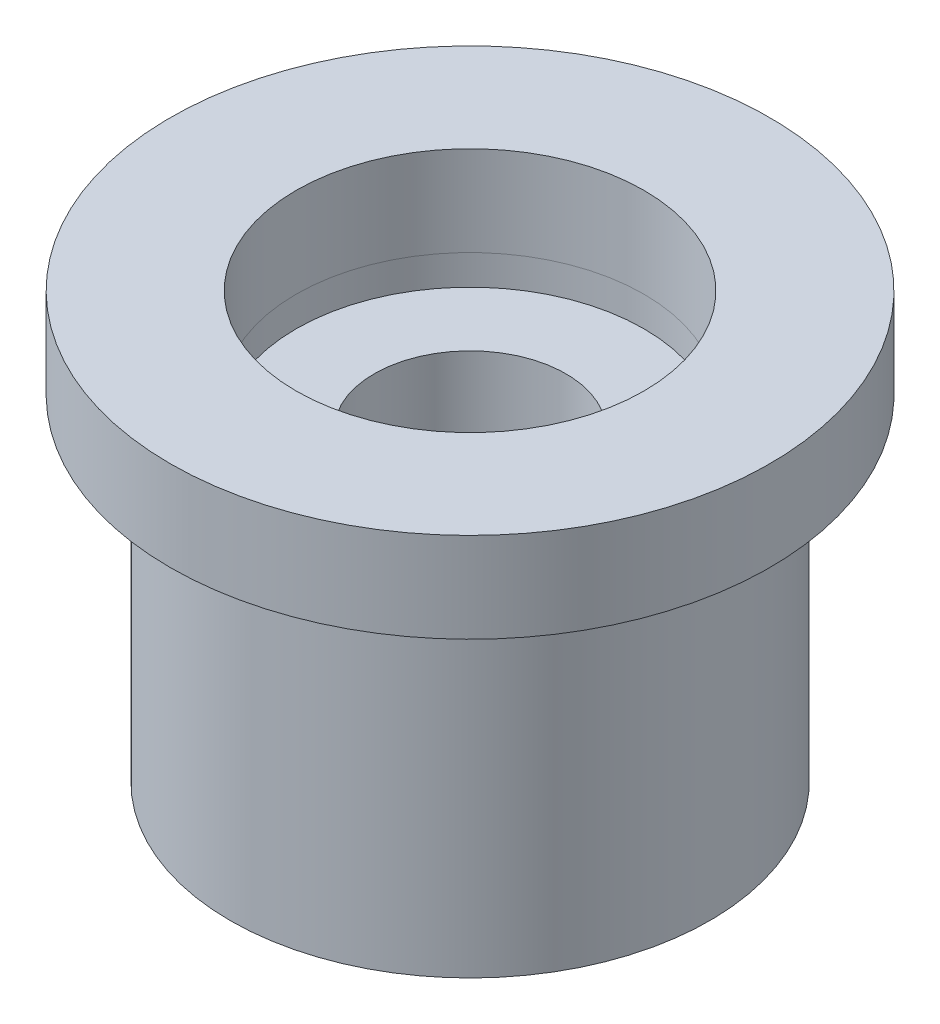
ISO-10303-21;
HEADER;
FILE_DESCRIPTION(('STEP AP214'),'2;1');
FILE_NAME('part.step','',(''),(''),'','','');
FILE_SCHEMA(('AUTOMOTIVE_DESIGN { 1 0 10303 214 1 1 1 1 }'));
ENDSEC;
DATA;
#1=APPLICATION_CONTEXT('core data for automotive mechanical design processes');
#2=APPLICATION_PROTOCOL_DEFINITION('international standard','automotive_design',2000,#1);
#3=PRODUCT_CONTEXT('',#1,'mechanical');
#4=PRODUCT('Part','Part','',(#3));
#5=PRODUCT_RELATED_PRODUCT_CATEGORY('part','',(#4));
#6=PRODUCT_DEFINITION_FORMATION('','',#4);
#7=PRODUCT_DEFINITION_CONTEXT('part definition',#1,'design');
#8=PRODUCT_DEFINITION('design','',#6,#7);
#9=PRODUCT_DEFINITION_SHAPE('','',#8);
#10=(LENGTH_UNIT() NAMED_UNIT(*) SI_UNIT(.MILLI.,.METRE.));
#11=(NAMED_UNIT(*) PLANE_ANGLE_UNIT() SI_UNIT($,.RADIAN.));
#12=(NAMED_UNIT(*) SI_UNIT($,.STERADIAN.) SOLID_ANGLE_UNIT());
#13=UNCERTAINTY_MEASURE_WITH_UNIT(LENGTH_MEASURE(1.E-05),#10,'distance_accuracy_value','');
#14=(GEOMETRIC_REPRESENTATION_CONTEXT(3) GLOBAL_UNCERTAINTY_ASSIGNED_CONTEXT((#13)) GLOBAL_UNIT_ASSIGNED_CONTEXT((#10,
#11,#12)) REPRESENTATION_CONTEXT('',''));
#15=CARTESIAN_POINT('',(0.,0.,0.));
#16=DIRECTION('',(0.,0.,1.));
#17=DIRECTION('',(1.,0.,0.));
#18=AXIS2_PLACEMENT_3D('',#15,#16,#17);
#19=CARTESIAN_POINT('',(0.,7.1,0.));
#20=DIRECTION('',(0.,-1.,0.));
#21=DIRECTION('',(0.,0.,-1.));
#22=AXIS2_PLACEMENT_3D('',#19,#20,#21);
#23=CYLINDRICAL_SURFACE('',#22,5.);
#24=CARTESIAN_POINT('',(0.,7.1,0.));
#25=DIRECTION('',(0.,1.,0.));
#26=DIRECTION('',(0.,0.,1.));
#27=AXIS2_PLACEMENT_3D('',#24,#25,#26);
#28=CIRCLE('',#27,5.);
#29=CARTESIAN_POINT('',(0.,7.1,5.));
#30=VERTEX_POINT('',#29);
#31=EDGE_CURVE('E11',#30,#30,#28,.T.);
#32=ORIENTED_EDGE('',*,*,#31,.F.);
#33=EDGE_LOOP('',(#32));
#34=FACE_BOUND('',#33,.T.);
#35=CARTESIAN_POINT('',(0.,5.6,0.));
#36=DIRECTION('',(0.,1.,0.));
#37=DIRECTION('',(0.,0.,1.));
#38=AXIS2_PLACEMENT_3D('',#35,#36,#37);
#39=CIRCLE('',#38,5.);
#40=CARTESIAN_POINT('',(0.,5.6,5.));
#41=VERTEX_POINT('',#40);
#42=EDGE_CURVE('E47',#41,#41,#39,.T.);
#43=ORIENTED_EDGE('',*,*,#42,.T.);
#44=EDGE_LOOP('',(#43));
#45=FACE_BOUND('',#44,.T.);
#46=ADVANCED_FACE('F40',(#34,#45),#23,.T.);
#47=CARTESIAN_POINT('',(0.,7.1,0.));
#48=DIRECTION('',(0.,1.,0.));
#49=DIRECTION('',(0.,0.,1.));
#50=AXIS2_PLACEMENT_3D('',#47,#48,#49);
#51=PLANE('',#50);
#52=CARTESIAN_POINT('',(0.,7.1,0.));
#53=DIRECTION('',(0.,1.,0.));
#54=DIRECTION('',(0.,0.,1.));
#55=AXIS2_PLACEMENT_3D('',#52,#53,#54);
#56=CIRCLE('',#55,2.9);
#57=CARTESIAN_POINT('',(0.,7.1,2.9));
#58=VERTEX_POINT('',#57);
#59=EDGE_CURVE('E53',#58,#58,#56,.T.);
#60=ORIENTED_EDGE('',*,*,#59,.F.);
#61=EDGE_LOOP('',(#60));
#62=FACE_BOUND('',#61,.T.);
#63=ORIENTED_EDGE('',*,*,#31,.T.);
#64=EDGE_LOOP('',(#63));
#65=FACE_BOUND('',#64,.T.);
#66=ADVANCED_FACE('F69',(#62,#65),#51,.T.);
#67=CARTESIAN_POINT('',(0.,5.6,0.));
#68=DIRECTION('',(0.,1.,0.));
#69=DIRECTION('',(0.,0.,1.));
#70=AXIS2_PLACEMENT_3D('',#67,#68,#69);
#71=PLANE('',#70);
#72=CARTESIAN_POINT('',(0.,5.6,0.));
#73=DIRECTION('',(0.,1.,0.));
#74=DIRECTION('',(0.,0.,1.));
#75=AXIS2_PLACEMENT_3D('',#72,#73,#74);
#76=CIRCLE('',#75,2.9);
#77=CARTESIAN_POINT('',(0.,5.6,2.9));
#78=VERTEX_POINT('',#77);
#79=EDGE_CURVE('E43',#78,#78,#76,.T.);
#80=ORIENTED_EDGE('',*,*,#79,.T.);
#81=EDGE_LOOP('',(#80));
#82=FACE_BOUND('',#81,.T.);
#83=ORIENTED_EDGE('',*,*,#42,.F.);
#84=EDGE_LOOP('',(#83));
#85=FACE_BOUND('',#84,.T.);
#86=ADVANCED_FACE('F60',(#82,#85),#71,.F.);
#87=CARTESIAN_POINT('',(0.,5.1,0.));
#88=DIRECTION('',(0.,1.,0.));
#89=DIRECTION('',(0.,0.,1.));
#90=AXIS2_PLACEMENT_3D('',#87,#88,#89);
#91=CYLINDRICAL_SURFACE('',#90,2.9);
#92=ORIENTED_EDGE('',*,*,#59,.T.);
#93=EDGE_LOOP('',(#92));
#94=FACE_BOUND('',#93,.T.);
#95=ORIENTED_EDGE('',*,*,#79,.F.);
#96=EDGE_LOOP('',(#95));
#97=FACE_BOUND('',#96,.T.);
#98=ADVANCED_FACE('F63',(#94,#97),#91,.F.);
#99=CLOSED_SHELL('',(#46,#66,#86,#98));
#100=MANIFOLD_SOLID_BREP('B2',#99);
#101=CARTESIAN_POINT('',(0.,5.6,0.));
#102=DIRECTION('',(0.,-1.,0.));
#103=DIRECTION('',(0.,0.,-1.));
#104=AXIS2_PLACEMENT_3D('',#101,#102,#103);
#105=CYLINDRICAL_SURFACE('',#104,4.);
#106=CARTESIAN_POINT('',(0.,5.6,0.));
#107=DIRECTION('',(0.,1.,0.));
#108=DIRECTION('',(0.,0.,1.));
#109=AXIS2_PLACEMENT_3D('',#106,#107,#108);
#110=CIRCLE('',#109,4.);
#111=CARTESIAN_POINT('',(0.,5.6,4.));
#112=VERTEX_POINT('',#111);
#113=EDGE_CURVE('E38',#112,#112,#110,.T.);
#114=ORIENTED_EDGE('',*,*,#113,.F.);
#115=EDGE_LOOP('',(#114));
#116=FACE_BOUND('',#115,.T.);
#117=CARTESIAN_POINT('',(0.,0.,0.));
#118=DIRECTION('',(0.,1.,0.));
#119=DIRECTION('',(0.,0.,1.));
#120=AXIS2_PLACEMENT_3D('',#117,#118,#119);
#121=CIRCLE('',#120,4.);
#122=CARTESIAN_POINT('',(0.,0.,4.));
#123=VERTEX_POINT('',#122);
#124=EDGE_CURVE('E109',#123,#123,#121,.T.);
#125=ORIENTED_EDGE('',*,*,#124,.T.);
#126=EDGE_LOOP('',(#125));
#127=FACE_BOUND('',#126,.T.);
#128=ADVANCED_FACE('F101',(#116,#127),#105,.T.);
#129=CARTESIAN_POINT('',(0.,5.6,0.));
#130=DIRECTION('',(0.,1.,0.));
#131=DIRECTION('',(0.,0.,1.));
#132=AXIS2_PLACEMENT_3D('',#129,#130,#131);
#133=PLANE('',#132);
#134=CARTESIAN_POINT('',(0.,5.6,0.));
#135=DIRECTION('',(0.,1.,0.));
#136=DIRECTION('',(0.,0.,1.));
#137=AXIS2_PLACEMENT_3D('',#134,#135,#136);
#138=CIRCLE('',#137,2.9);
#139=CARTESIAN_POINT('',(0.,5.6,2.9));
#140=VERTEX_POINT('',#139);
#141=EDGE_CURVE('E104',#140,#140,#138,.T.);
#142=ORIENTED_EDGE('',*,*,#141,.F.);
#143=EDGE_LOOP('',(#142));
#144=FACE_BOUND('',#143,.T.);
#145=ORIENTED_EDGE('',*,*,#113,.T.);
#146=EDGE_LOOP('',(#145));
#147=FACE_BOUND('',#146,.T.);
#148=ADVANCED_FACE('F308',(#144,#147),#133,.T.);
#149=CARTESIAN_POINT('',(0.,0.,0.));
#150=DIRECTION('',(0.,1.,0.));
#151=DIRECTION('',(0.,0.,1.));
#152=AXIS2_PLACEMENT_3D('',#149,#150,#151);
#153=PLANE('',#152);
#154=DIRECTION('',(0.499999999999992,0.,-0.866025403784443));
#155=VECTOR('',#154,1.);
#156=CARTESIAN_POINT('',(-0.786065003776817,0.,2.16150452459331));
#157=LINE('',#156,#155);
#158=CARTESIAN_POINT('',(-1.19063245338014,0.,2.86223590239484));
#159=VERTEX_POINT('',#158);
#160=CARTESIAN_POINT('',(-0.786065003776817,0.,2.16150452459331));
#161=VERTEX_POINT('',#160);
#162=EDGE_CURVE('E220',#159,#161,#157,.T.);
#163=ORIENTED_EDGE('',*,*,#162,.F.);
#164=CARTESIAN_POINT('',(0.,0.,0.));
#165=DIRECTION('',(0.,-1.,0.));
#166=DIRECTION('',(0.,0.,-1.));
#167=AXIS2_PLACEMENT_3D('',#164,#165,#166);
#168=CIRCLE('',#167,3.1);
#169=CARTESIAN_POINT('',(3.07408522978788,0.,0.4));
#170=VERTEX_POINT('',#169);
#171=EDGE_CURVE('E117',#170,#159,#168,.T.);
#172=ORIENTED_EDGE('',*,*,#171,.F.);
#173=DIRECTION('',(1.,0.,0.));
#174=VECTOR('',#173,1.);
#175=CARTESIAN_POINT('',(2.26495033058123,0.,0.4));
#176=LINE('',#175,#174);
#177=CARTESIAN_POINT('',(2.26495033058123,0.,0.4));
#178=VERTEX_POINT('',#177);
#179=EDGE_CURVE('E211',#178,#170,#176,.T.);
#180=ORIENTED_EDGE('',*,*,#179,.F.);
#181=CARTESIAN_POINT('',(0.,0.,0.));
#182=DIRECTION('',(0.,1.,0.));
#183=DIRECTION('',(0.,0.,-1.));
#184=AXIS2_PLACEMENT_3D('',#181,#182,#183);
#185=CIRCLE('',#184,2.3);
#186=EDGE_CURVE('E214',#161,#178,#185,.T.);
#187=ORIENTED_EDGE('',*,*,#186,.F.);
#188=EDGE_LOOP('',(#163,#172,#180,#187));
#189=FACE_BOUND('',#188,.T.);
#190=DIRECTION('',(-0.499999999999992,0.,0.866025403784443));
#191=VECTOR('',#190,1.);
#192=CARTESIAN_POINT('',(-1.47888532680437,0.,1.76150452459332));
#193=LINE('',#192,#191);
#194=CARTESIAN_POINT('',(-1.47888532680437,0.,1.76150452459332));
#195=VERTEX_POINT('',#194);
#196=CARTESIAN_POINT('',(-1.88345277640769,0.,2.46223590239485));
#197=VERTEX_POINT('',#196);
#198=EDGE_CURVE('E244',#195,#197,#193,.T.);
#199=ORIENTED_EDGE('',*,*,#198,.F.);
#200=CARTESIAN_POINT('',(0.,0.,0.));
#201=DIRECTION('',(0.,1.,0.));
#202=DIRECTION('',(0.,0.,-1.));
#203=AXIS2_PLACEMENT_3D('',#200,#201,#202);
#204=CIRCLE('',#203,2.3);
#205=CARTESIAN_POINT('',(-1.4788853268044,0.,-1.7615045245933));
#206=VERTEX_POINT('',#205);
#207=EDGE_CURVE('E125',#206,#195,#204,.T.);
#208=ORIENTED_EDGE('',*,*,#207,.F.);
#209=DIRECTION('',(0.500000000000004,0.,0.866025403784436));
#210=VECTOR('',#209,1.);
#211=CARTESIAN_POINT('',(-1.4788853268044,0.,-1.7615045245933));
#212=LINE('',#211,#210);
#213=CARTESIAN_POINT('',(-1.88345277640773,0.,-2.46223590239482));
#214=VERTEX_POINT('',#213);
#215=EDGE_CURVE('E233',#214,#206,#212,.T.);
#216=ORIENTED_EDGE('',*,*,#215,.F.);
#217=CARTESIAN_POINT('',(0.,0.,0.));
#218=DIRECTION('',(0.,-1.,0.));
#219=DIRECTION('',(0.,0.,-1.));
#220=AXIS2_PLACEMENT_3D('',#217,#218,#219);
#221=CIRCLE('',#220,3.1);
#222=EDGE_CURVE('E247',#197,#214,#221,.T.);
#223=ORIENTED_EDGE('',*,*,#222,.F.);
#224=EDGE_LOOP('',(#199,#208,#216,#223));
#225=FACE_BOUND('',#224,.T.);
#226=DIRECTION('',(-0.500000000000004,0.,-0.866025403784436));
#227=VECTOR('',#226,1.);
#228=CARTESIAN_POINT('',(-0.786065003776847,0.,-2.1615045245933));
#229=LINE('',#228,#227);
#230=CARTESIAN_POINT('',(-0.786065003776847,0.,-2.1615045245933));
#231=VERTEX_POINT('',#230);
#232=CARTESIAN_POINT('',(-1.19063245338018,0.,-2.86223590239482));
#233=VERTEX_POINT('',#232);
#234=EDGE_CURVE('E275',#231,#233,#229,.T.);
#235=ORIENTED_EDGE('',*,*,#234,.F.);
#236=CARTESIAN_POINT('',(0.,0.,0.));
#237=DIRECTION('',(0.,1.,0.));
#238=DIRECTION('',(0.,0.,-1.));
#239=AXIS2_PLACEMENT_3D('',#236,#237,#238);
#240=CIRCLE('',#239,2.3);
#241=CARTESIAN_POINT('',(2.26495033058123,0.,-0.4));
#242=VERTEX_POINT('',#241);
#243=EDGE_CURVE('E254',#242,#231,#240,.T.);
#244=ORIENTED_EDGE('',*,*,#243,.F.);
#245=DIRECTION('',(-1.,0.,0.));
#246=VECTOR('',#245,1.);
#247=CARTESIAN_POINT('',(2.26495033058123,0.,-0.4));
#248=LINE('',#247,#246);
#249=CARTESIAN_POINT('',(3.07408522978788,0.,-0.4));
#250=VERTEX_POINT('',#249);
#251=EDGE_CURVE('E264',#250,#242,#248,.T.);
#252=ORIENTED_EDGE('',*,*,#251,.F.);
#253=CARTESIAN_POINT('',(0.,0.,0.));
#254=DIRECTION('',(0.,-1.,0.));
#255=DIRECTION('',(0.,0.,-1.));
#256=AXIS2_PLACEMENT_3D('',#253,#254,#255);
#257=CIRCLE('',#256,3.1);
#258=EDGE_CURVE('E278',#233,#250,#257,.T.);
#259=ORIENTED_EDGE('',*,*,#258,.F.);
#260=EDGE_LOOP('',(#235,#244,#252,#259));
#261=FACE_BOUND('',#260,.T.);
#262=CARTESIAN_POINT('',(0.,0.,0.));
#263=DIRECTION('',(0.,1.,0.));
#264=DIRECTION('',(0.,0.,1.));
#265=AXIS2_PLACEMENT_3D('',#262,#263,#264);
#266=CIRCLE('',#265,1.6);
#267=CARTESIAN_POINT('',(0.,0.,1.6));
#268=VERTEX_POINT('',#267);
#269=EDGE_CURVE('E292',#268,#268,#266,.T.);
#270=ORIENTED_EDGE('',*,*,#269,.T.);
#271=EDGE_LOOP('',(#270));
#272=FACE_BOUND('',#271,.T.);
#273=ORIENTED_EDGE('',*,*,#124,.F.);
#274=EDGE_LOOP('',(#273));
#275=FACE_BOUND('',#274,.T.);
#276=ADVANCED_FACE('F311',(#189,#225,#261,#272,#275),#153,.F.);
#277=CARTESIAN_POINT('',(0.,5.1,0.));
#278=DIRECTION('',(0.,1.,0.));
#279=DIRECTION('',(0.,0.,1.));
#280=AXIS2_PLACEMENT_3D('',#277,#278,#279);
#281=CYLINDRICAL_SURFACE('',#280,2.9);
#282=ORIENTED_EDGE('',*,*,#141,.T.);
#283=EDGE_LOOP('',(#282));
#284=FACE_BOUND('',#283,.T.);
#285=CARTESIAN_POINT('',(0.,5.1,0.));
#286=DIRECTION('',(0.,1.,0.));
#287=DIRECTION('',(0.,0.,1.));
#288=AXIS2_PLACEMENT_3D('',#285,#286,#287);
#289=CIRCLE('',#288,2.9);
#290=CARTESIAN_POINT('',(0.,5.1,2.9));
#291=VERTEX_POINT('',#290);
#292=EDGE_CURVE('E295',#291,#291,#289,.T.);
#293=ORIENTED_EDGE('',*,*,#292,.F.);
#294=EDGE_LOOP('',(#293));
#295=FACE_BOUND('',#294,.T.);
#296=ADVANCED_FACE('F305',(#284,#295),#281,.F.);
#297=CARTESIAN_POINT('',(0.,5.1,0.));
#298=DIRECTION('',(0.,1.,0.));
#299=DIRECTION('',(0.,0.,1.));
#300=AXIS2_PLACEMENT_3D('',#297,#298,#299);
#301=PLANE('',#300);
#302=CARTESIAN_POINT('',(0.,5.1,0.));
#303=DIRECTION('',(0.,1.,0.));
#304=DIRECTION('',(0.,0.,1.));
#305=AXIS2_PLACEMENT_3D('',#302,#303,#304);
#306=CIRCLE('',#305,1.6);
#307=CARTESIAN_POINT('',(0.,5.1,1.6));
#308=VERTEX_POINT('',#307);
#309=EDGE_CURVE('E285',#308,#308,#306,.T.);
#310=ORIENTED_EDGE('',*,*,#309,.F.);
#311=EDGE_LOOP('',(#310));
#312=FACE_BOUND('',#311,.T.);
#313=ORIENTED_EDGE('',*,*,#292,.T.);
#314=EDGE_LOOP('',(#313));
#315=FACE_BOUND('',#314,.T.);
#316=ADVANCED_FACE('F336',(#312,#315),#301,.T.);
#317=CARTESIAN_POINT('',(0.,0.,0.));
#318=DIRECTION('',(0.,1.,0.));
#319=DIRECTION('',(0.,0.,1.));
#320=AXIS2_PLACEMENT_3D('',#317,#318,#319);
#321=CYLINDRICAL_SURFACE('',#320,1.6);
#322=ORIENTED_EDGE('',*,*,#269,.F.);
#323=EDGE_LOOP('',(#322));
#324=FACE_BOUND('',#323,.T.);
#325=ORIENTED_EDGE('',*,*,#309,.T.);
#326=EDGE_LOOP('',(#325));
#327=FACE_BOUND('',#326,.T.);
#328=ADVANCED_FACE('F343',(#324,#327),#321,.F.);
#329=CARTESIAN_POINT('',(0.,4.3,0.));
#330=DIRECTION('',(0.,-1.,0.));
#331=DIRECTION('',(0.,0.,-1.));
#332=AXIS2_PLACEMENT_3D('',#329,#330,#331);
#333=CYLINDRICAL_SURFACE('',#332,2.3);
#334=ORIENTED_EDGE('',*,*,#243,.T.);
#335=DIRECTION('',(0.,-1.,0.));
#336=VECTOR('',#335,1.);
#337=CARTESIAN_POINT('',(-0.786065003776847,4.3,-2.1615045245933));
#338=LINE('',#337,#336);
#339=CARTESIAN_POINT('',(-0.786065003776847,4.3,-2.1615045245933));
#340=VERTEX_POINT('',#339);
#341=EDGE_CURVE('E273',#340,#231,#338,.T.);
#342=ORIENTED_EDGE('',*,*,#341,.F.);
#343=CARTESIAN_POINT('',(0.,4.3,0.));
#344=DIRECTION('',(0.,1.,0.));
#345=DIRECTION('',(0.,0.,-1.));
#346=AXIS2_PLACEMENT_3D('',#343,#344,#345);
#347=CIRCLE('',#346,2.3);
#348=CARTESIAN_POINT('',(2.26495033058123,4.3,-0.4));
#349=VERTEX_POINT('',#348);
#350=EDGE_CURVE('E260',#349,#340,#347,.T.);
#351=ORIENTED_EDGE('',*,*,#350,.F.);
#352=DIRECTION('',(0.,-1.,0.));
#353=VECTOR('',#352,1.);
#354=CARTESIAN_POINT('',(2.26495033058123,4.3,-0.4));
#355=LINE('',#354,#353);
#356=EDGE_CURVE('E283',#349,#242,#355,.T.);
#357=ORIENTED_EDGE('',*,*,#356,.T.);
#358=EDGE_LOOP('',(#334,#342,#351,#357));
#359=FACE_BOUND('',#358,.T.);
#360=ADVANCED_FACE('F350',(#359),#333,.T.);
#361=CARTESIAN_POINT('',(2.26495033058123,4.3,-0.4));
#362=DIRECTION('',(0.,0.,1.));
#363=DIRECTION('',(1.,0.,0.));
#364=AXIS2_PLACEMENT_3D('',#361,#362,#363);
#365=PLANE('',#364);
#366=ORIENTED_EDGE('',*,*,#251,.T.);
#367=ORIENTED_EDGE('',*,*,#356,.F.);
#368=DIRECTION('',(-1.,0.,0.));
#369=VECTOR('',#368,1.);
#370=CARTESIAN_POINT('',(2.26495033058123,4.3,-0.4));
#371=LINE('',#370,#369);
#372=CARTESIAN_POINT('',(3.07408522978788,4.3,-0.4));
#373=VERTEX_POINT('',#372);
#374=EDGE_CURVE('E270',#373,#349,#371,.T.);
#375=ORIENTED_EDGE('',*,*,#374,.F.);
#376=DIRECTION('',(0.,-1.,0.));
#377=VECTOR('',#376,1.);
#378=CARTESIAN_POINT('',(3.07408522978788,4.3,-0.4));
#379=LINE('',#378,#377);
#380=EDGE_CURVE('E286',#373,#250,#379,.T.);
#381=ORIENTED_EDGE('',*,*,#380,.T.);
#382=EDGE_LOOP('',(#366,#367,#375,#381));
#383=FACE_BOUND('',#382,.T.);
#384=ADVANCED_FACE('F357',(#383),#365,.F.);
#385=CARTESIAN_POINT('',(0.,4.3,0.));
#386=DIRECTION('',(0.,-1.,0.));
#387=DIRECTION('',(0.,0.,-1.));
#388=AXIS2_PLACEMENT_3D('',#385,#386,#387);
#389=CYLINDRICAL_SURFACE('',#388,3.1);
#390=ORIENTED_EDGE('',*,*,#258,.T.);
#391=ORIENTED_EDGE('',*,*,#380,.F.);
#392=CARTESIAN_POINT('',(0.,4.3,0.));
#393=DIRECTION('',(0.,-1.,0.));
#394=DIRECTION('',(0.,0.,-1.));
#395=AXIS2_PLACEMENT_3D('',#392,#393,#394);
#396=CIRCLE('',#395,3.1);
#397=CARTESIAN_POINT('',(-1.19063245338018,4.3,-2.86223590239482));
#398=VERTEX_POINT('',#397);
#399=EDGE_CURVE('E267',#398,#373,#396,.T.);
#400=ORIENTED_EDGE('',*,*,#399,.F.);
#401=DIRECTION('',(0.,-1.,0.));
#402=VECTOR('',#401,1.);
#403=CARTESIAN_POINT('',(-1.19063245338018,4.3,-2.86223590239482));
#404=LINE('',#403,#402);
#405=EDGE_CURVE('E288',#398,#233,#404,.T.);
#406=ORIENTED_EDGE('',*,*,#405,.T.);
#407=EDGE_LOOP('',(#390,#391,#400,#406));
#408=FACE_BOUND('',#407,.T.);
#409=ADVANCED_FACE('F365',(#408),#389,.F.);
#410=CARTESIAN_POINT('',(-0.786065003776847,4.3,-2.1615045245933));
#411=DIRECTION('',(-0.866025403784436,0.,0.500000000000004));
#412=DIRECTION('',(0.500000000000004,0.,0.866025403784436));
#413=AXIS2_PLACEMENT_3D('',#410,#411,#412);
#414=PLANE('',#413);
#415=ORIENTED_EDGE('',*,*,#234,.T.);
#416=ORIENTED_EDGE('',*,*,#405,.F.);
#417=DIRECTION('',(-0.500000000000004,0.,-0.866025403784436));
#418=VECTOR('',#417,1.);
#419=CARTESIAN_POINT('',(-0.786065003776847,4.3,-2.1615045245933));
#420=LINE('',#419,#418);
#421=EDGE_CURVE('E263',#340,#398,#420,.T.);
#422=ORIENTED_EDGE('',*,*,#421,.F.);
#423=ORIENTED_EDGE('',*,*,#341,.T.);
#424=EDGE_LOOP('',(#415,#416,#422,#423));
#425=FACE_BOUND('',#424,.T.);
#426=ADVANCED_FACE('F373',(#425),#414,.F.);
#427=CARTESIAN_POINT('',(0.,4.3,0.));
#428=DIRECTION('',(0.,-1.,0.));
#429=DIRECTION('',(0.,0.,-1.));
#430=AXIS2_PLACEMENT_3D('',#427,#428,#429);
#431=PLANE('',#430);
#432=ORIENTED_EDGE('',*,*,#350,.T.);
#433=ORIENTED_EDGE('',*,*,#421,.T.);
#434=ORIENTED_EDGE('',*,*,#399,.T.);
#435=ORIENTED_EDGE('',*,*,#374,.T.);
#436=EDGE_LOOP('',(#432,#433,#434,#435));
#437=FACE_BOUND('',#436,.T.);
#438=ADVANCED_FACE('F381',(#437),#431,.T.);
#439=CARTESIAN_POINT('',(0.,4.3,0.));
#440=DIRECTION('',(0.,-1.,0.));
#441=DIRECTION('',(0.,0.,-1.));
#442=AXIS2_PLACEMENT_3D('',#439,#440,#441);
#443=CYLINDRICAL_SURFACE('',#442,2.3);
#444=ORIENTED_EDGE('',*,*,#207,.T.);
#445=DIRECTION('',(0.,-1.,0.));
#446=VECTOR('',#445,1.);
#447=CARTESIAN_POINT('',(-1.47888532680437,4.3,1.76150452459332));
#448=LINE('',#447,#446);
#449=CARTESIAN_POINT('',(-1.47888532680437,4.3,1.76150452459332));
#450=VERTEX_POINT('',#449);
#451=EDGE_CURVE('E242',#450,#195,#448,.T.);
#452=ORIENTED_EDGE('',*,*,#451,.F.);
#453=CARTESIAN_POINT('',(0.,4.3,0.));
#454=DIRECTION('',(0.,1.,0.));
#455=DIRECTION('',(0.,0.,-1.));
#456=AXIS2_PLACEMENT_3D('',#453,#454,#455);
#457=CIRCLE('',#456,2.3);
#458=CARTESIAN_POINT('',(-1.4788853268044,4.3,-1.7615045245933));
#459=VERTEX_POINT('',#458);
#460=EDGE_CURVE('E229',#459,#450,#457,.T.);
#461=ORIENTED_EDGE('',*,*,#460,.F.);
#462=DIRECTION('',(0.,-1.,0.));
#463=VECTOR('',#462,1.);
#464=CARTESIAN_POINT('',(-1.4788853268044,4.3,-1.7615045245933));
#465=LINE('',#464,#463);
#466=EDGE_CURVE('E252',#459,#206,#465,.T.);
#467=ORIENTED_EDGE('',*,*,#466,.T.);
#468=EDGE_LOOP('',(#444,#452,#461,#467));
#469=FACE_BOUND('',#468,.T.);
#470=ADVANCED_FACE('F389',(#469),#443,.T.);
#471=CARTESIAN_POINT('',(-1.4788853268044,4.3,-1.7615045245933));
#472=DIRECTION('',(0.866025403784436,0.,-0.500000000000004));
#473=DIRECTION('',(-0.500000000000004,0.,-0.866025403784436));
#474=AXIS2_PLACEMENT_3D('',#471,#472,#473);
#475=PLANE('',#474);
#476=ORIENTED_EDGE('',*,*,#215,.T.);
#477=ORIENTED_EDGE('',*,*,#466,.F.);
#478=DIRECTION('',(0.500000000000004,0.,0.866025403784436));
#479=VECTOR('',#478,1.);
#480=CARTESIAN_POINT('',(-1.4788853268044,4.3,-1.7615045245933));
#481=LINE('',#480,#479);
#482=CARTESIAN_POINT('',(-1.88345277640773,4.3,-2.46223590239482));
#483=VERTEX_POINT('',#482);
#484=EDGE_CURVE('E239',#483,#459,#481,.T.);
#485=ORIENTED_EDGE('',*,*,#484,.F.);
#486=DIRECTION('',(0.,-1.,0.));
#487=VECTOR('',#486,1.);
#488=CARTESIAN_POINT('',(-1.88345277640773,4.3,-2.46223590239482));
#489=LINE('',#488,#487);
#490=EDGE_CURVE('E255',#483,#214,#489,.T.);
#491=ORIENTED_EDGE('',*,*,#490,.T.);
#492=EDGE_LOOP('',(#476,#477,#485,#491));
#493=FACE_BOUND('',#492,.T.);
#494=ADVANCED_FACE('F397',(#493),#475,.F.);
#495=CARTESIAN_POINT('',(0.,4.3,0.));
#496=DIRECTION('',(0.,-1.,0.));
#497=DIRECTION('',(0.,0.,-1.));
#498=AXIS2_PLACEMENT_3D('',#495,#496,#497);
#499=CYLINDRICAL_SURFACE('',#498,3.1);
#500=ORIENTED_EDGE('',*,*,#222,.T.);
#501=ORIENTED_EDGE('',*,*,#490,.F.);
#502=CARTESIAN_POINT('',(0.,4.3,0.));
#503=DIRECTION('',(0.,-1.,0.));
#504=DIRECTION('',(0.,0.,-1.));
#505=AXIS2_PLACEMENT_3D('',#502,#503,#504);
#506=CIRCLE('',#505,3.1);
#507=CARTESIAN_POINT('',(-1.88345277640769,4.3,2.46223590239485));
#508=VERTEX_POINT('',#507);
#509=EDGE_CURVE('E236',#508,#483,#506,.T.);
#510=ORIENTED_EDGE('',*,*,#509,.F.);
#511=DIRECTION('',(0.,-1.,0.));
#512=VECTOR('',#511,1.);
#513=CARTESIAN_POINT('',(-1.88345277640769,4.3,2.46223590239485));
#514=LINE('',#513,#512);
#515=EDGE_CURVE('E257',#508,#197,#514,.T.);
#516=ORIENTED_EDGE('',*,*,#515,.T.);
#517=EDGE_LOOP('',(#500,#501,#510,#516));
#518=FACE_BOUND('',#517,.T.);
#519=ADVANCED_FACE('F404',(#518),#499,.F.);
#520=CARTESIAN_POINT('',(-1.47888532680437,4.3,1.76150452459332));
#521=DIRECTION('',(0.866025403784443,0.,0.499999999999992));
#522=DIRECTION('',(0.499999999999992,0.,-0.866025403784443));
#523=AXIS2_PLACEMENT_3D('',#520,#521,#522);
#524=PLANE('',#523);
#525=ORIENTED_EDGE('',*,*,#198,.T.);
#526=ORIENTED_EDGE('',*,*,#515,.F.);
#527=DIRECTION('',(-0.499999999999992,0.,0.866025403784443));
#528=VECTOR('',#527,1.);
#529=CARTESIAN_POINT('',(-1.47888532680437,4.3,1.76150452459332));
#530=LINE('',#529,#528);
#531=EDGE_CURVE('E232',#450,#508,#530,.T.);
#532=ORIENTED_EDGE('',*,*,#531,.F.);
#533=ORIENTED_EDGE('',*,*,#451,.T.);
#534=EDGE_LOOP('',(#525,#526,#532,#533));
#535=FACE_BOUND('',#534,.T.);
#536=ADVANCED_FACE('F412',(#535),#524,.F.);
#537=CARTESIAN_POINT('',(0.,4.3,0.));
#538=DIRECTION('',(0.,-1.,0.));
#539=DIRECTION('',(0.,0.,-1.));
#540=AXIS2_PLACEMENT_3D('',#537,#538,#539);
#541=PLANE('',#540);
#542=ORIENTED_EDGE('',*,*,#460,.T.);
#543=ORIENTED_EDGE('',*,*,#531,.T.);
#544=ORIENTED_EDGE('',*,*,#509,.T.);
#545=ORIENTED_EDGE('',*,*,#484,.T.);
#546=EDGE_LOOP('',(#542,#543,#544,#545));
#547=FACE_BOUND('',#546,.T.);
#548=ADVANCED_FACE('F420',(#547),#541,.T.);
#549=CARTESIAN_POINT('',(0.,4.3,0.));
#550=DIRECTION('',(0.,-1.,0.));
#551=DIRECTION('',(0.,0.,-1.));
#552=AXIS2_PLACEMENT_3D('',#549,#550,#551);
#553=CYLINDRICAL_SURFACE('',#552,3.1);
#554=ORIENTED_EDGE('',*,*,#171,.T.);
#555=DIRECTION('',(0.,-1.,0.));
#556=VECTOR('',#555,1.);
#557=CARTESIAN_POINT('',(-1.19063245338014,4.3,2.86223590239484));
#558=LINE('',#557,#556);
#559=CARTESIAN_POINT('',(-1.19063245338014,4.3,2.86223590239484));
#560=VERTEX_POINT('',#559);
#561=EDGE_CURVE('E189',#560,#159,#558,.T.);
#562=ORIENTED_EDGE('',*,*,#561,.F.);
#563=CARTESIAN_POINT('',(0.,4.3,0.));
#564=DIRECTION('',(0.,-1.,0.));
#565=DIRECTION('',(0.,0.,-1.));
#566=AXIS2_PLACEMENT_3D('',#563,#564,#565);
#567=CIRCLE('',#566,3.1);
#568=CARTESIAN_POINT('',(3.07408522978788,4.3,0.4));
#569=VERTEX_POINT('',#568);
#570=EDGE_CURVE('E193',#569,#560,#567,.T.);
#571=ORIENTED_EDGE('',*,*,#570,.F.);
#572=DIRECTION('',(0.,-1.,0.));
#573=VECTOR('',#572,1.);
#574=CARTESIAN_POINT('',(3.07408522978788,4.3,0.4));
#575=LINE('',#574,#573);
#576=EDGE_CURVE('E224',#569,#170,#575,.T.);
#577=ORIENTED_EDGE('',*,*,#576,.T.);
#578=EDGE_LOOP('',(#554,#562,#571,#577));
#579=FACE_BOUND('',#578,.T.);
#580=ADVANCED_FACE('F191',(#579),#553,.F.);
#581=CARTESIAN_POINT('',(2.26495033058123,4.3,0.4));
#582=DIRECTION('',(0.,0.,-1.));
#583=DIRECTION('',(-1.,0.,0.));
#584=AXIS2_PLACEMENT_3D('',#581,#582,#583);
#585=PLANE('',#584);
#586=ORIENTED_EDGE('',*,*,#179,.T.);
#587=ORIENTED_EDGE('',*,*,#576,.F.);
#588=DIRECTION('',(1.,0.,0.));
#589=VECTOR('',#588,1.);
#590=CARTESIAN_POINT('',(2.26495033058123,4.3,0.4));
#591=LINE('',#590,#589);
#592=CARTESIAN_POINT('',(2.26495033058123,4.3,0.4));
#593=VERTEX_POINT('',#592);
#594=EDGE_CURVE('E199',#593,#569,#591,.T.);
#595=ORIENTED_EDGE('',*,*,#594,.F.);
#596=DIRECTION('',(0.,-1.,0.));
#597=VECTOR('',#596,1.);
#598=CARTESIAN_POINT('',(2.26495033058123,4.3,0.4));
#599=LINE('',#598,#597);
#600=EDGE_CURVE('E226',#593,#178,#599,.T.);
#601=ORIENTED_EDGE('',*,*,#600,.T.);
#602=EDGE_LOOP('',(#586,#587,#595,#601));
#603=FACE_BOUND('',#602,.T.);
#604=ADVANCED_FACE('F435',(#603),#585,.F.);
#605=CARTESIAN_POINT('',(0.,4.3,0.));
#606=DIRECTION('',(0.,-1.,0.));
#607=DIRECTION('',(0.,0.,-1.));
#608=AXIS2_PLACEMENT_3D('',#605,#606,#607);
#609=CYLINDRICAL_SURFACE('',#608,2.3);
#610=ORIENTED_EDGE('',*,*,#186,.T.);
#611=ORIENTED_EDGE('',*,*,#600,.F.);
#612=CARTESIAN_POINT('',(0.,4.3,0.));
#613=DIRECTION('',(0.,1.,0.));
#614=DIRECTION('',(0.,0.,-1.));
#615=AXIS2_PLACEMENT_3D('',#612,#613,#614);
#616=CIRCLE('',#615,2.3);
#617=CARTESIAN_POINT('',(-0.786065003776817,4.3,2.16150452459331));
#618=VERTEX_POINT('',#617);
#619=EDGE_CURVE('E207',#618,#593,#616,.T.);
#620=ORIENTED_EDGE('',*,*,#619,.F.);
#621=DIRECTION('',(0.,-1.,0.));
#622=VECTOR('',#621,1.);
#623=CARTESIAN_POINT('',(-0.786065003776817,4.3,2.16150452459331));
#624=LINE('',#623,#622);
#625=EDGE_CURVE('E198',#618,#161,#624,.T.);
#626=ORIENTED_EDGE('',*,*,#625,.T.);
#627=EDGE_LOOP('',(#610,#611,#620,#626));
#628=FACE_BOUND('',#627,.T.);
#629=ADVANCED_FACE('F442',(#628),#609,.T.);
#630=CARTESIAN_POINT('',(-0.786065003776817,4.3,2.16150452459331));
#631=DIRECTION('',(-0.866025403784443,0.,-0.499999999999992));
#632=DIRECTION('',(-0.499999999999992,0.,0.866025403784443));
#633=AXIS2_PLACEMENT_3D('',#630,#631,#632);
#634=PLANE('',#633);
#635=ORIENTED_EDGE('',*,*,#162,.T.);
#636=ORIENTED_EDGE('',*,*,#625,.F.);
#637=DIRECTION('',(0.499999999999992,0.,-0.866025403784443));
#638=VECTOR('',#637,1.);
#639=CARTESIAN_POINT('',(-0.786065003776817,4.3,2.16150452459331));
#640=LINE('',#639,#638);
#641=EDGE_CURVE('E202',#560,#618,#640,.T.);
#642=ORIENTED_EDGE('',*,*,#641,.F.);
#643=ORIENTED_EDGE('',*,*,#561,.T.);
#644=EDGE_LOOP('',(#635,#636,#642,#643));
#645=FACE_BOUND('',#644,.T.);
#646=ADVANCED_FACE('F203',(#645),#634,.F.);
#647=CARTESIAN_POINT('',(0.,4.3,0.));
#648=DIRECTION('',(0.,-1.,0.));
#649=DIRECTION('',(0.,0.,-1.));
#650=AXIS2_PLACEMENT_3D('',#647,#648,#649);
#651=PLANE('',#650);
#652=ORIENTED_EDGE('',*,*,#570,.T.);
#653=ORIENTED_EDGE('',*,*,#641,.T.);
#654=ORIENTED_EDGE('',*,*,#619,.T.);
#655=ORIENTED_EDGE('',*,*,#594,.T.);
#656=EDGE_LOOP('',(#652,#653,#654,#655));
#657=FACE_BOUND('',#656,.T.);
#658=ADVANCED_FACE('F209',(#657),#651,.T.);
#659=CLOSED_SHELL('',(#128,#148,#276,#296,#316,#328,#360,#384,#409,#426,#438,#470,#494,#519,
#536,#548,#580,#604,#629,#646,#658));
#660=MANIFOLD_SOLID_BREP('B6',#659);
#661=ADVANCED_BREP_SHAPE_REPRESENTATION('',(#18,#100,#660),#14);
#662=SHAPE_DEFINITION_REPRESENTATION(#9,#661);
ENDSEC;
END-ISO-10303-21;
